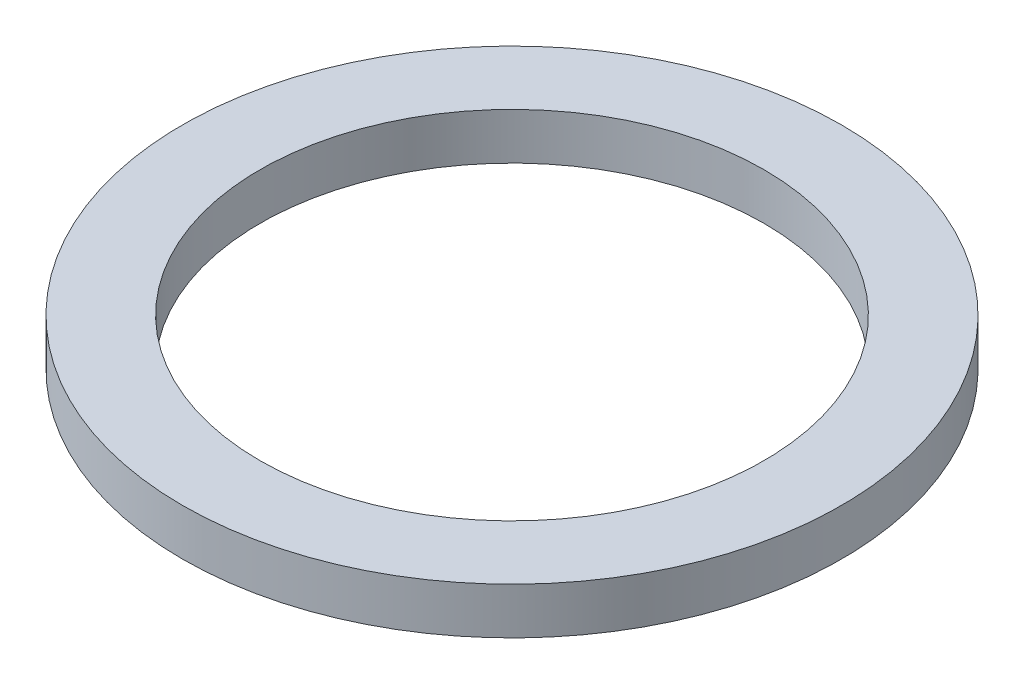
ISO-10303-21;
HEADER;
FILE_DESCRIPTION(('STEP AP214'),'2;1');
FILE_NAME('part.step','',(''),(''),'','','');
FILE_SCHEMA(('AUTOMOTIVE_DESIGN { 1 0 10303 214 1 1 1 1 }'));
ENDSEC;
DATA;
#1=APPLICATION_CONTEXT('core data for automotive mechanical design processes');
#2=APPLICATION_PROTOCOL_DEFINITION('international standard','automotive_design',2000,#1);
#3=PRODUCT_CONTEXT('',#1,'mechanical');
#4=PRODUCT('Part','Part','',(#3));
#5=PRODUCT_RELATED_PRODUCT_CATEGORY('part','',(#4));
#6=PRODUCT_DEFINITION_FORMATION('','',#4);
#7=PRODUCT_DEFINITION_CONTEXT('part definition',#1,'design');
#8=PRODUCT_DEFINITION('design','',#6,#7);
#9=PRODUCT_DEFINITION_SHAPE('','',#8);
#10=(LENGTH_UNIT() NAMED_UNIT(*) SI_UNIT(.MILLI.,.METRE.));
#11=(NAMED_UNIT(*) PLANE_ANGLE_UNIT() SI_UNIT($,.RADIAN.));
#12=(NAMED_UNIT(*) SI_UNIT($,.STERADIAN.) SOLID_ANGLE_UNIT());
#13=UNCERTAINTY_MEASURE_WITH_UNIT(LENGTH_MEASURE(1.E-05),#10,'distance_accuracy_value','');
#14=(GEOMETRIC_REPRESENTATION_CONTEXT(3) GLOBAL_UNCERTAINTY_ASSIGNED_CONTEXT((#13)) GLOBAL_UNIT_ASSIGNED_CONTEXT((#10,
#11,#12)) REPRESENTATION_CONTEXT('',''));
#15=CARTESIAN_POINT('',(0.,0.,0.));
#16=DIRECTION('',(0.,0.,1.));
#17=DIRECTION('',(1.,0.,0.));
#18=AXIS2_PLACEMENT_3D('',#15,#16,#17);
#19=CARTESIAN_POINT('',(0.,0.6,0.));
#20=DIRECTION('',(0.,1.,0.));
#21=DIRECTION('',(0.,0.,1.));
#22=AXIS2_PLACEMENT_3D('',#19,#20,#21);
#23=PLANE('',#22);
#24=CARTESIAN_POINT('',(0.,0.6,0.));
#25=DIRECTION('',(0.,1.,0.));
#26=DIRECTION('',(0.,0.,1.));
#27=AXIS2_PLACEMENT_3D('',#24,#25,#26);
#28=CIRCLE('',#27,4.25);
#29=CARTESIAN_POINT('',(0.,0.6,4.25));
#30=VERTEX_POINT('',#29);
#31=EDGE_CURVE('E10',#30,#30,#28,.T.);
#32=ORIENTED_EDGE('',*,*,#31,.T.);
#33=EDGE_LOOP('',(#32));
#34=FACE_BOUND('',#33,.T.);
#35=CARTESIAN_POINT('',(0.,0.6,0.));
#36=DIRECTION('',(0.,1.,0.));
#37=DIRECTION('',(0.,0.,1.));
#38=AXIS2_PLACEMENT_3D('',#35,#36,#37);
#39=CIRCLE('',#38,3.25);
#40=CARTESIAN_POINT('',(0.,0.6,3.25));
#41=VERTEX_POINT('',#40);
#42=EDGE_CURVE('E50',#41,#41,#39,.T.);
#43=ORIENTED_EDGE('',*,*,#42,.F.);
#44=EDGE_LOOP('',(#43));
#45=FACE_BOUND('',#44,.T.);
#46=ADVANCED_FACE('F39',(#34,#45),#23,.T.);
#47=CARTESIAN_POINT('',(0.,0.,0.));
#48=DIRECTION('',(0.,1.,0.));
#49=DIRECTION('',(0.,0.,1.));
#50=AXIS2_PLACEMENT_3D('',#47,#48,#49);
#51=PLANE('',#50);
#52=CARTESIAN_POINT('',(0.,0.,0.));
#53=DIRECTION('',(0.,1.,0.));
#54=DIRECTION('',(0.,0.,1.));
#55=AXIS2_PLACEMENT_3D('',#52,#53,#54);
#56=CIRCLE('',#55,4.25);
#57=CARTESIAN_POINT('',(0.,0.,4.25));
#58=VERTEX_POINT('',#57);
#59=EDGE_CURVE('E43',#58,#58,#56,.T.);
#60=ORIENTED_EDGE('',*,*,#59,.F.);
#61=EDGE_LOOP('',(#60));
#62=FACE_BOUND('',#61,.T.);
#63=CARTESIAN_POINT('',(0.,0.,0.));
#64=DIRECTION('',(0.,1.,0.));
#65=DIRECTION('',(0.,0.,1.));
#66=AXIS2_PLACEMENT_3D('',#63,#64,#65);
#67=CIRCLE('',#66,3.25);
#68=CARTESIAN_POINT('',(0.,0.,3.25));
#69=VERTEX_POINT('',#68);
#70=EDGE_CURVE('E52',#69,#69,#67,.T.);
#71=ORIENTED_EDGE('',*,*,#70,.T.);
#72=EDGE_LOOP('',(#71));
#73=FACE_BOUND('',#72,.T.);
#74=ADVANCED_FACE('F62',(#62,#73),#51,.F.);
#75=CARTESIAN_POINT('',(0.,0.6,0.));
#76=DIRECTION('',(0.,-1.,0.));
#77=DIRECTION('',(0.,0.,-1.));
#78=AXIS2_PLACEMENT_3D('',#75,#76,#77);
#79=CYLINDRICAL_SURFACE('',#78,4.25);
#80=ORIENTED_EDGE('',*,*,#31,.F.);
#81=EDGE_LOOP('',(#80));
#82=FACE_BOUND('',#81,.T.);
#83=ORIENTED_EDGE('',*,*,#59,.T.);
#84=EDGE_LOOP('',(#83));
#85=FACE_BOUND('',#84,.T.);
#86=ADVANCED_FACE('F41',(#82,#85),#79,.T.);
#87=CARTESIAN_POINT('',(0.,0.6,0.));
#88=DIRECTION('',(0.,-1.,0.));
#89=DIRECTION('',(0.,0.,-1.));
#90=AXIS2_PLACEMENT_3D('',#87,#88,#89);
#91=CYLINDRICAL_SURFACE('',#90,3.25);
#92=ORIENTED_EDGE('',*,*,#42,.T.);
#93=EDGE_LOOP('',(#92));
#94=FACE_BOUND('',#93,.T.);
#95=ORIENTED_EDGE('',*,*,#70,.F.);
#96=EDGE_LOOP('',(#95));
#97=FACE_BOUND('',#96,.T.);
#98=ADVANCED_FACE('F58',(#94,#97),#91,.F.);
#99=CLOSED_SHELL('',(#46,#74,#86,#98));
#100=MANIFOLD_SOLID_BREP('B2',#99);
#101=ADVANCED_BREP_SHAPE_REPRESENTATION('',(#18,#100),#14);
#102=SHAPE_DEFINITION_REPRESENTATION(#9,#101);
ENDSEC;
END-ISO-10303-21;
